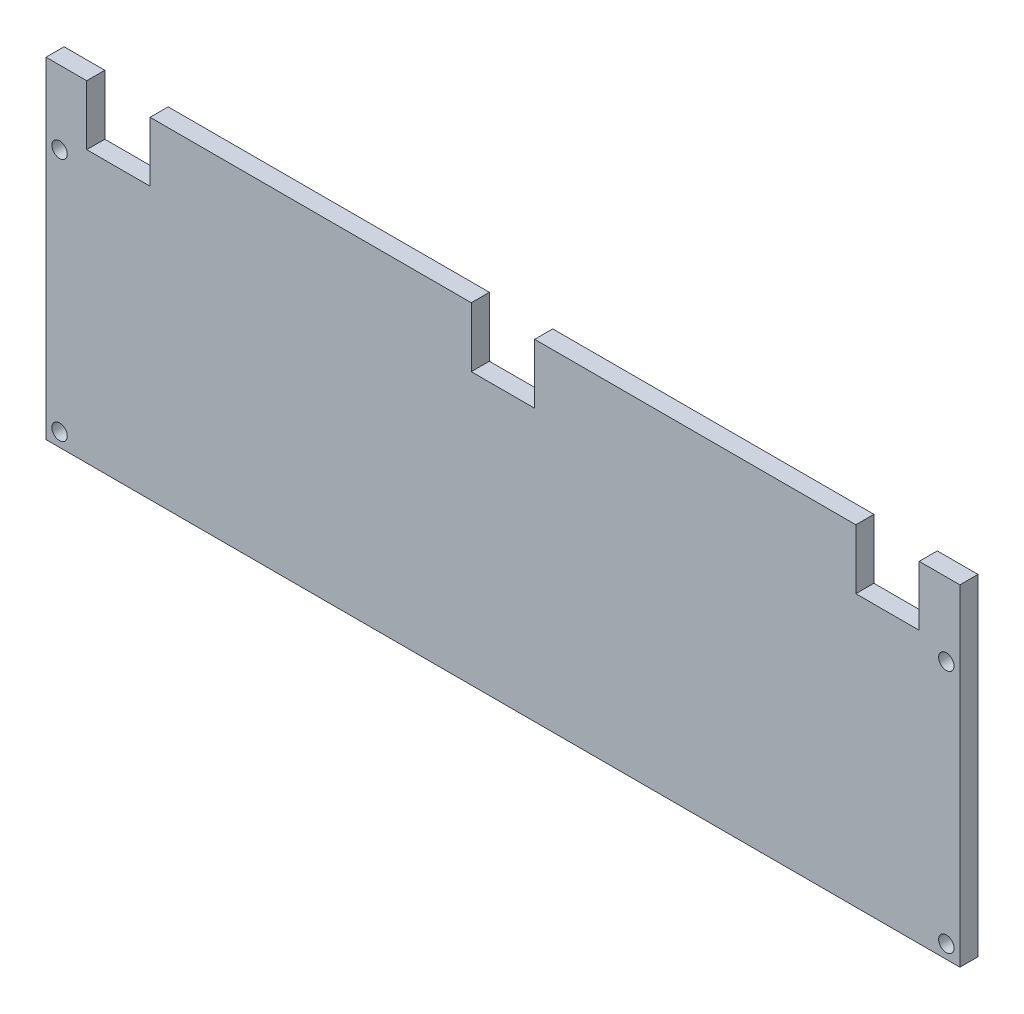
ISO-10303-21;
HEADER;
FILE_DESCRIPTION(('STEP AP214'),'2;1');
FILE_NAME('part.step','',(''),(''),'','','');
FILE_SCHEMA(('AUTOMOTIVE_DESIGN { 1 0 10303 214 1 1 1 1 }'));
ENDSEC;
DATA;
#1=APPLICATION_CONTEXT('core data for automotive mechanical design processes');
#2=APPLICATION_PROTOCOL_DEFINITION('international standard','automotive_design',2000,#1);
#3=PRODUCT_CONTEXT('',#1,'mechanical');
#4=PRODUCT('Part','Part','',(#3));
#5=PRODUCT_RELATED_PRODUCT_CATEGORY('part','',(#4));
#6=PRODUCT_DEFINITION_FORMATION('','',#4);
#7=PRODUCT_DEFINITION_CONTEXT('part definition',#1,'design');
#8=PRODUCT_DEFINITION('design','',#6,#7);
#9=PRODUCT_DEFINITION_SHAPE('','',#8);
#10=(LENGTH_UNIT() NAMED_UNIT(*) SI_UNIT(.MILLI.,.METRE.));
#11=(NAMED_UNIT(*) PLANE_ANGLE_UNIT() SI_UNIT($,.RADIAN.));
#12=(NAMED_UNIT(*) SI_UNIT($,.STERADIAN.) SOLID_ANGLE_UNIT());
#13=UNCERTAINTY_MEASURE_WITH_UNIT(LENGTH_MEASURE(1.E-05),#10,'distance_accuracy_value','');
#14=(GEOMETRIC_REPRESENTATION_CONTEXT(3) GLOBAL_UNCERTAINTY_ASSIGNED_CONTEXT((#13)) GLOBAL_UNIT_ASSIGNED_CONTEXT((#10,
#11,#12)) REPRESENTATION_CONTEXT('',''));
#15=CARTESIAN_POINT('',(0.,0.,0.));
#16=DIRECTION('',(0.,0.,1.));
#17=DIRECTION('',(1.,0.,0.));
#18=AXIS2_PLACEMENT_3D('',#15,#16,#17);
#19=CARTESIAN_POINT('',(-252.5,75.,-10.));
#20=DIRECTION('',(0.,1.,0.));
#21=DIRECTION('',(0.,0.,1.));
#22=AXIS2_PLACEMENT_3D('',#19,#20,#21);
#23=PLANE('',#22);
#24=DIRECTION('',(0.,0.,1.));
#25=VECTOR('',#24,1.);
#26=CARTESIAN_POINT('',(-17.5000000000003,74.9999999999988,-10.));
#27=LINE('',#26,#25);
#28=CARTESIAN_POINT('',(-17.5000000000003,74.9999999999988,-10.));
#29=VERTEX_POINT('',#28);
#30=CARTESIAN_POINT('',(-17.5000000000003,74.9999999999988,0.));
#31=VERTEX_POINT('',#30);
#32=EDGE_CURVE('E205',#29,#31,#27,.T.);
#33=ORIENTED_EDGE('',*,*,#32,.T.);
#34=DIRECTION('',(-1.,0.,0.));
#35=VECTOR('',#34,1.);
#36=CARTESIAN_POINT('',(-252.5,75.,0.));
#37=LINE('',#36,#35);
#38=CARTESIAN_POINT('',(17.4999999999997,75.,0.));
#39=VERTEX_POINT('',#38);
#40=EDGE_CURVE('E299',#39,#31,#37,.T.);
#41=ORIENTED_EDGE('',*,*,#40,.F.);
#42=DIRECTION('',(0.,0.,1.));
#43=VECTOR('',#42,1.);
#44=CARTESIAN_POINT('',(17.4999999999997,75.,-10.));
#45=LINE('',#44,#43);
#46=CARTESIAN_POINT('',(17.4999999999997,75.,-10.));
#47=VERTEX_POINT('',#46);
#48=EDGE_CURVE('E232',#47,#39,#45,.T.);
#49=ORIENTED_EDGE('',*,*,#48,.F.);
#50=DIRECTION('',(-1.,0.,0.));
#51=VECTOR('',#50,1.);
#52=CARTESIAN_POINT('',(-252.5,75.,-10.));
#53=LINE('',#52,#51);
#54=EDGE_CURVE('E288',#47,#29,#53,.T.);
#55=ORIENTED_EDGE('',*,*,#54,.T.);
#56=EDGE_LOOP('',(#33,#41,#49,#55));
#57=FACE_BOUND('',#56,.T.);
#58=ADVANCED_FACE('F41',(#57),#23,.T.);
#59=DIRECTION('',(0.,0.,1.));
#60=VECTOR('',#59,1.);
#61=CARTESIAN_POINT('',(195.,75.,-10.));
#62=LINE('',#61,#60);
#63=CARTESIAN_POINT('',(195.,75.,-10.));
#64=VERTEX_POINT('',#63);
#65=CARTESIAN_POINT('',(195.,75.,0.));
#66=VERTEX_POINT('',#65);
#67=EDGE_CURVE('E228',#64,#66,#62,.T.);
#68=ORIENTED_EDGE('',*,*,#67,.T.);
#69=CARTESIAN_POINT('',(230.,75.,0.));
#70=VERTEX_POINT('',#69);
#71=EDGE_CURVE('E295',#70,#66,#37,.T.);
#72=ORIENTED_EDGE('',*,*,#71,.F.);
#73=DIRECTION('',(0.,0.,1.));
#74=VECTOR('',#73,1.);
#75=CARTESIAN_POINT('',(230.,75.,-10.));
#76=LINE('',#75,#74);
#77=CARTESIAN_POINT('',(230.,75.,-10.));
#78=VERTEX_POINT('',#77);
#79=EDGE_CURVE('E249',#78,#70,#76,.T.);
#80=ORIENTED_EDGE('',*,*,#79,.F.);
#81=EDGE_CURVE('E285',#78,#64,#53,.T.);
#82=ORIENTED_EDGE('',*,*,#81,.T.);
#83=EDGE_LOOP('',(#68,#72,#80,#82));
#84=FACE_BOUND('',#83,.T.);
#85=ADVANCED_FACE('F320',(#84),#23,.T.);
#86=CARTESIAN_POINT('',(252.5,-75.,-10.));
#87=DIRECTION('',(1.,0.,0.));
#88=DIRECTION('',(0.,0.,-1.));
#89=AXIS2_PLACEMENT_3D('',#86,#87,#88);
#90=PLANE('',#89);
#91=DIRECTION('',(0.,1.,0.));
#92=VECTOR('',#91,1.);
#93=CARTESIAN_POINT('',(252.5,-75.,0.));
#94=LINE('',#93,#92);
#95=CARTESIAN_POINT('',(252.5,-75.,0.));
#96=VERTEX_POINT('',#95);
#97=CARTESIAN_POINT('',(252.5,108.,0.));
#98=VERTEX_POINT('',#97);
#99=EDGE_CURVE('E272',#96,#98,#94,.T.);
#100=ORIENTED_EDGE('',*,*,#99,.F.);
#101=DIRECTION('',(0.,0.,1.));
#102=VECTOR('',#101,1.);
#103=CARTESIAN_POINT('',(252.5,-75.,-10.));
#104=LINE('',#103,#102);
#105=CARTESIAN_POINT('',(252.5,-75.,-10.));
#106=VERTEX_POINT('',#105);
#107=EDGE_CURVE('E11',#106,#96,#104,.T.);
#108=ORIENTED_EDGE('',*,*,#107,.F.);
#109=DIRECTION('',(0.,1.,0.));
#110=VECTOR('',#109,1.);
#111=CARTESIAN_POINT('',(252.5,-75.,-10.));
#112=LINE('',#111,#110);
#113=CARTESIAN_POINT('',(252.5,108.,-10.));
#114=VERTEX_POINT('',#113);
#115=EDGE_CURVE('E281',#106,#114,#112,.T.);
#116=ORIENTED_EDGE('',*,*,#115,.T.);
#117=DIRECTION('',(0.,0.,1.));
#118=VECTOR('',#117,1.);
#119=CARTESIAN_POINT('',(252.5,108.,-10.));
#120=LINE('',#119,#118);
#121=EDGE_CURVE('E244',#114,#98,#120,.T.);
#122=ORIENTED_EDGE('',*,*,#121,.T.);
#123=EDGE_LOOP('',(#100,#108,#116,#122));
#124=FACE_BOUND('',#123,.T.);
#125=ADVANCED_FACE('F43',(#124),#90,.T.);
#126=CARTESIAN_POINT('',(-252.5,-75.,-10.));
#127=DIRECTION('',(0.,-1.,0.));
#128=DIRECTION('',(0.,0.,-1.));
#129=AXIS2_PLACEMENT_3D('',#126,#127,#128);
#130=PLANE('',#129);
#131=DIRECTION('',(1.,0.,0.));
#132=VECTOR('',#131,1.);
#133=CARTESIAN_POINT('',(-252.5,-75.,0.));
#134=LINE('',#133,#132);
#135=CARTESIAN_POINT('',(-252.5,-75.,0.));
#136=VERTEX_POINT('',#135);
#137=EDGE_CURVE('E284',#136,#96,#134,.T.);
#138=ORIENTED_EDGE('',*,*,#137,.F.);
#139=DIRECTION('',(0.,0.,1.));
#140=VECTOR('',#139,1.);
#141=CARTESIAN_POINT('',(-252.5,-75.,-10.));
#142=LINE('',#141,#140);
#143=CARTESIAN_POINT('',(-252.5,-75.,-10.));
#144=VERTEX_POINT('',#143);
#145=EDGE_CURVE('E45',#144,#136,#142,.T.);
#146=ORIENTED_EDGE('',*,*,#145,.F.);
#147=DIRECTION('',(1.,0.,0.));
#148=VECTOR('',#147,1.);
#149=CARTESIAN_POINT('',(-252.5,-75.,-10.));
#150=LINE('',#149,#148);
#151=EDGE_CURVE('E290',#144,#106,#150,.T.);
#152=ORIENTED_EDGE('',*,*,#151,.T.);
#153=ORIENTED_EDGE('',*,*,#107,.T.);
#154=EDGE_LOOP('',(#138,#146,#152,#153));
#155=FACE_BOUND('',#154,.T.);
#156=ADVANCED_FACE('F307',(#155),#130,.T.);
#157=CARTESIAN_POINT('',(-252.5,-75.,-10.));
#158=DIRECTION('',(-1.,0.,0.));
#159=DIRECTION('',(0.,0.,1.));
#160=AXIS2_PLACEMENT_3D('',#157,#158,#159);
#161=PLANE('',#160);
#162=DIRECTION('',(0.,-1.,0.));
#163=VECTOR('',#162,1.);
#164=CARTESIAN_POINT('',(-252.5,-75.,0.));
#165=LINE('',#164,#163);
#166=CARTESIAN_POINT('',(-252.5,108.,0.));
#167=VERTEX_POINT('',#166);
#168=EDGE_CURVE('E298',#167,#136,#165,.T.);
#169=ORIENTED_EDGE('',*,*,#168,.F.);
#170=DIRECTION('',(0.,0.,1.));
#171=VECTOR('',#170,1.);
#172=CARTESIAN_POINT('',(-252.5,108.,-10.));
#173=LINE('',#172,#171);
#174=CARTESIAN_POINT('',(-252.5,108.,-10.));
#175=VERTEX_POINT('',#174);
#176=EDGE_CURVE('E166',#175,#167,#173,.T.);
#177=ORIENTED_EDGE('',*,*,#176,.F.);
#178=DIRECTION('',(0.,-1.,0.));
#179=VECTOR('',#178,1.);
#180=CARTESIAN_POINT('',(-252.5,-75.,-10.));
#181=LINE('',#180,#179);
#182=EDGE_CURVE('E177',#175,#144,#181,.T.);
#183=ORIENTED_EDGE('',*,*,#182,.T.);
#184=ORIENTED_EDGE('',*,*,#145,.T.);
#185=EDGE_LOOP('',(#169,#177,#183,#184));
#186=FACE_BOUND('',#185,.T.);
#187=ADVANCED_FACE('F366',(#186),#161,.T.);
#188=DIRECTION('',(0.,0.,1.));
#189=VECTOR('',#188,1.);
#190=CARTESIAN_POINT('',(-230.,74.9999999999988,-10.));
#191=LINE('',#190,#189);
#192=CARTESIAN_POINT('',(-230.,74.9999999999988,-10.));
#193=VERTEX_POINT('',#192);
#194=CARTESIAN_POINT('',(-230.,74.9999999999988,0.));
#195=VERTEX_POINT('',#194);
#196=EDGE_CURVE('E182',#193,#195,#191,.T.);
#197=ORIENTED_EDGE('',*,*,#196,.T.);
#198=CARTESIAN_POINT('',(-195.,75.,0.));
#199=VERTEX_POINT('',#198);
#200=EDGE_CURVE('E294',#199,#195,#37,.T.);
#201=ORIENTED_EDGE('',*,*,#200,.F.);
#202=DIRECTION('',(0.,0.,1.));
#203=VECTOR('',#202,1.);
#204=CARTESIAN_POINT('',(-195.,74.9999999999988,-10.));
#205=LINE('',#204,#203);
#206=CARTESIAN_POINT('',(-195.,74.9999999999988,-10.));
#207=VERTEX_POINT('',#206);
#208=EDGE_CURVE('E209',#207,#199,#205,.T.);
#209=ORIENTED_EDGE('',*,*,#208,.F.);
#210=EDGE_CURVE('E283',#207,#193,#53,.T.);
#211=ORIENTED_EDGE('',*,*,#210,.T.);
#212=EDGE_LOOP('',(#197,#201,#209,#211));
#213=FACE_BOUND('',#212,.T.);
#214=ADVANCED_FACE('F339',(#213),#23,.T.);
#215=CARTESIAN_POINT('',(0.,0.,-10.));
#216=DIRECTION('',(0.,0.,-1.));
#217=DIRECTION('',(-1.,0.,0.));
#218=AXIS2_PLACEMENT_3D('',#215,#216,#217);
#219=PLANE('',#218);
#220=CARTESIAN_POINT('',(-244.999999999999,-67.5,-10.));
#221=DIRECTION('',(0.,0.,-1.));
#222=DIRECTION('',(1.,0.,0.));
#223=AXIS2_PLACEMENT_3D('',#220,#221,#222);
#224=CIRCLE('',#223,4.25000000000001);
#225=CARTESIAN_POINT('',(-240.749999999999,-67.5,-10.));
#226=VERTEX_POINT('',#225);
#227=EDGE_CURVE('E257',#226,#226,#224,.T.);
#228=ORIENTED_EDGE('',*,*,#227,.F.);
#229=EDGE_LOOP('',(#228));
#230=FACE_BOUND('',#229,.T.);
#231=CARTESIAN_POINT('',(244.999999999999,-67.5,-10.));
#232=DIRECTION('',(0.,0.,-1.));
#233=DIRECTION('',(-1.,0.,0.));
#234=AXIS2_PLACEMENT_3D('',#231,#232,#233);
#235=CIRCLE('',#234,4.25000000000001);
#236=CARTESIAN_POINT('',(240.749999999999,-67.5,-10.));
#237=VERTEX_POINT('',#236);
#238=EDGE_CURVE('E264',#237,#237,#235,.T.);
#239=ORIENTED_EDGE('',*,*,#238,.F.);
#240=EDGE_LOOP('',(#239));
#241=FACE_BOUND('',#240,.T.);
#242=CARTESIAN_POINT('',(-244.999999999999,67.5,-10.));
#243=DIRECTION('',(0.,0.,1.));
#244=DIRECTION('',(1.,0.,0.));
#245=AXIS2_PLACEMENT_3D('',#242,#243,#244);
#246=CIRCLE('',#245,4.25000000000001);
#247=CARTESIAN_POINT('',(-240.749999999999,67.5,-10.));
#248=VERTEX_POINT('',#247);
#249=EDGE_CURVE('E269',#248,#248,#246,.T.);
#250=ORIENTED_EDGE('',*,*,#249,.T.);
#251=EDGE_LOOP('',(#250));
#252=FACE_BOUND('',#251,.T.);
#253=CARTESIAN_POINT('',(244.999999999999,67.5,-10.));
#254=DIRECTION('',(0.,0.,1.));
#255=DIRECTION('',(-1.,0.,0.));
#256=AXIS2_PLACEMENT_3D('',#253,#254,#255);
#257=CIRCLE('',#256,4.25000000000001);
#258=CARTESIAN_POINT('',(240.749999999999,67.5,-10.));
#259=VERTEX_POINT('',#258);
#260=EDGE_CURVE('E276',#259,#259,#257,.T.);
#261=ORIENTED_EDGE('',*,*,#260,.T.);
#262=EDGE_LOOP('',(#261));
#263=FACE_BOUND('',#262,.T.);
#264=ORIENTED_EDGE('',*,*,#115,.F.);
#265=ORIENTED_EDGE('',*,*,#151,.F.);
#266=ORIENTED_EDGE('',*,*,#182,.F.);
#267=DIRECTION('',(-1.,0.,0.));
#268=VECTOR('',#267,1.);
#269=CARTESIAN_POINT('',(-230.,108.,-10.));
#270=LINE('',#269,#268);
#271=CARTESIAN_POINT('',(-230.,108.,-10.));
#272=VERTEX_POINT('',#271);
#273=EDGE_CURVE('E160',#272,#175,#270,.T.);
#274=ORIENTED_EDGE('',*,*,#273,.F.);
#275=DIRECTION('',(0.,1.,0.));
#276=VECTOR('',#275,1.);
#277=CARTESIAN_POINT('',(-230.,74.9999999999988,-10.));
#278=LINE('',#277,#276);
#279=EDGE_CURVE('E173',#193,#272,#278,.T.);
#280=ORIENTED_EDGE('',*,*,#279,.F.);
#281=ORIENTED_EDGE('',*,*,#210,.F.);
#282=DIRECTION('',(0.,-1.,0.));
#283=VECTOR('',#282,1.);
#284=CARTESIAN_POINT('',(-195.,74.9999999999988,-10.));
#285=LINE('',#284,#283);
#286=CARTESIAN_POINT('',(-195.,108.,-10.));
#287=VERTEX_POINT('',#286);
#288=EDGE_CURVE('E197',#287,#207,#285,.T.);
#289=ORIENTED_EDGE('',*,*,#288,.F.);
#290=DIRECTION('',(-1.,0.,0.));
#291=VECTOR('',#290,1.);
#292=CARTESIAN_POINT('',(-17.5000000000003,108.,-10.));
#293=LINE('',#292,#291);
#294=CARTESIAN_POINT('',(-17.5000000000003,108.,-10.));
#295=VERTEX_POINT('',#294);
#296=EDGE_CURVE('E194',#295,#287,#293,.T.);
#297=ORIENTED_EDGE('',*,*,#296,.F.);
#298=DIRECTION('',(0.,1.,0.));
#299=VECTOR('',#298,1.);
#300=CARTESIAN_POINT('',(-17.5000000000003,74.9999999999988,-10.));
#301=LINE('',#300,#299);
#302=EDGE_CURVE('E191',#29,#295,#301,.T.);
#303=ORIENTED_EDGE('',*,*,#302,.F.);
#304=ORIENTED_EDGE('',*,*,#54,.F.);
#305=DIRECTION('',(0.,-1.,0.));
#306=VECTOR('',#305,1.);
#307=CARTESIAN_POINT('',(17.4999999999997,75.,-10.));
#308=LINE('',#307,#306);
#309=CARTESIAN_POINT('',(17.4999999999997,108.,-10.));
#310=VERTEX_POINT('',#309);
#311=EDGE_CURVE('E220',#310,#47,#308,.T.);
#312=ORIENTED_EDGE('',*,*,#311,.F.);
#313=DIRECTION('',(-1.,0.,0.));
#314=VECTOR('',#313,1.);
#315=CARTESIAN_POINT('',(195.,108.,-10.));
#316=LINE('',#315,#314);
#317=CARTESIAN_POINT('',(195.,108.,-10.));
#318=VERTEX_POINT('',#317);
#319=EDGE_CURVE('E217',#318,#310,#316,.T.);
#320=ORIENTED_EDGE('',*,*,#319,.F.);
#321=DIRECTION('',(0.,1.,0.));
#322=VECTOR('',#321,1.);
#323=CARTESIAN_POINT('',(195.,75.,-10.));
#324=LINE('',#323,#322);
#325=EDGE_CURVE('E214',#64,#318,#324,.T.);
#326=ORIENTED_EDGE('',*,*,#325,.F.);
#327=ORIENTED_EDGE('',*,*,#81,.F.);
#328=DIRECTION('',(0.,-1.,0.));
#329=VECTOR('',#328,1.);
#330=CARTESIAN_POINT('',(230.,75.,-10.));
#331=LINE('',#330,#329);
#332=CARTESIAN_POINT('',(230.,108.,-10.));
#333=VERTEX_POINT('',#332);
#334=EDGE_CURVE('E240',#333,#78,#331,.T.);
#335=ORIENTED_EDGE('',*,*,#334,.F.);
#336=DIRECTION('',(-1.,0.,0.));
#337=VECTOR('',#336,1.);
#338=CARTESIAN_POINT('',(252.5,108.,-10.));
#339=LINE('',#338,#337);
#340=EDGE_CURVE('E237',#114,#333,#339,.T.);
#341=ORIENTED_EDGE('',*,*,#340,.F.);
#342=EDGE_LOOP('',(#264,#265,#266,#274,#280,#281,#289,#297,#303,#304,#312,#320,#326,#327,#335,#341));
#343=FACE_BOUND('',#342,.T.);
#344=ADVANCED_FACE('F171',(#230,#241,#252,#263,#343),#219,.T.);
#345=CARTESIAN_POINT('',(0.,0.,0.));
#346=DIRECTION('',(0.,0.,-1.));
#347=DIRECTION('',(-1.,0.,0.));
#348=AXIS2_PLACEMENT_3D('',#345,#346,#347);
#349=PLANE('',#348);
#350=CARTESIAN_POINT('',(-244.999999999999,-67.5,0.));
#351=DIRECTION('',(0.,0.,-1.));
#352=DIRECTION('',(1.,0.,0.));
#353=AXIS2_PLACEMENT_3D('',#350,#351,#352);
#354=CIRCLE('',#353,4.25000000000001);
#355=CARTESIAN_POINT('',(-240.749999999999,-67.5,0.));
#356=VERTEX_POINT('',#355);
#357=EDGE_CURVE('E261',#356,#356,#354,.T.);
#358=ORIENTED_EDGE('',*,*,#357,.T.);
#359=EDGE_LOOP('',(#358));
#360=FACE_BOUND('',#359,.T.);
#361=CARTESIAN_POINT('',(244.999999999999,-67.5,0.));
#362=DIRECTION('',(0.,0.,-1.));
#363=DIRECTION('',(-1.,0.,0.));
#364=AXIS2_PLACEMENT_3D('',#361,#362,#363);
#365=CIRCLE('',#364,4.25000000000001);
#366=CARTESIAN_POINT('',(240.749999999999,-67.5,0.));
#367=VERTEX_POINT('',#366);
#368=EDGE_CURVE('E252',#367,#367,#365,.T.);
#369=ORIENTED_EDGE('',*,*,#368,.T.);
#370=EDGE_LOOP('',(#369));
#371=FACE_BOUND('',#370,.T.);
#372=CARTESIAN_POINT('',(-244.999999999999,67.5,0.));
#373=DIRECTION('',(0.,0.,1.));
#374=DIRECTION('',(1.,0.,0.));
#375=AXIS2_PLACEMENT_3D('',#372,#373,#374);
#376=CIRCLE('',#375,4.25000000000001);
#377=CARTESIAN_POINT('',(-240.749999999999,67.5,0.));
#378=VERTEX_POINT('',#377);
#379=EDGE_CURVE('E273',#378,#378,#376,.T.);
#380=ORIENTED_EDGE('',*,*,#379,.F.);
#381=EDGE_LOOP('',(#380));
#382=FACE_BOUND('',#381,.T.);
#383=CARTESIAN_POINT('',(244.999999999999,67.5,0.));
#384=DIRECTION('',(0.,0.,1.));
#385=DIRECTION('',(-1.,0.,0.));
#386=AXIS2_PLACEMENT_3D('',#383,#384,#385);
#387=CIRCLE('',#386,4.25000000000001);
#388=CARTESIAN_POINT('',(240.749999999999,67.5,0.));
#389=VERTEX_POINT('',#388);
#390=EDGE_CURVE('E260',#389,#389,#387,.T.);
#391=ORIENTED_EDGE('',*,*,#390,.F.);
#392=EDGE_LOOP('',(#391));
#393=FACE_BOUND('',#392,.T.);
#394=ORIENTED_EDGE('',*,*,#99,.T.);
#395=DIRECTION('',(-1.,0.,0.));
#396=VECTOR('',#395,1.);
#397=CARTESIAN_POINT('',(252.5,108.,0.));
#398=LINE('',#397,#396);
#399=CARTESIAN_POINT('',(230.,108.,0.));
#400=VERTEX_POINT('',#399);
#401=EDGE_CURVE('E231',#98,#400,#398,.T.);
#402=ORIENTED_EDGE('',*,*,#401,.T.);
#403=DIRECTION('',(0.,-1.,0.));
#404=VECTOR('',#403,1.);
#405=CARTESIAN_POINT('',(230.,75.,0.));
#406=LINE('',#405,#404);
#407=EDGE_CURVE('E241',#400,#70,#406,.T.);
#408=ORIENTED_EDGE('',*,*,#407,.T.);
#409=ORIENTED_EDGE('',*,*,#71,.T.);
#410=DIRECTION('',(0.,1.,0.));
#411=VECTOR('',#410,1.);
#412=CARTESIAN_POINT('',(195.,75.,0.));
#413=LINE('',#412,#411);
#414=CARTESIAN_POINT('',(195.,108.,0.));
#415=VERTEX_POINT('',#414);
#416=EDGE_CURVE('E208',#66,#415,#413,.T.);
#417=ORIENTED_EDGE('',*,*,#416,.T.);
#418=DIRECTION('',(-1.,0.,0.));
#419=VECTOR('',#418,1.);
#420=CARTESIAN_POINT('',(195.,108.,0.));
#421=LINE('',#420,#419);
#422=CARTESIAN_POINT('',(17.4999999999997,108.,0.));
#423=VERTEX_POINT('',#422);
#424=EDGE_CURVE('E225',#415,#423,#421,.T.);
#425=ORIENTED_EDGE('',*,*,#424,.T.);
#426=DIRECTION('',(0.,-1.,0.));
#427=VECTOR('',#426,1.);
#428=CARTESIAN_POINT('',(17.4999999999997,75.,0.));
#429=LINE('',#428,#427);
#430=EDGE_CURVE('E63',#423,#39,#429,.T.);
#431=ORIENTED_EDGE('',*,*,#430,.T.);
#432=ORIENTED_EDGE('',*,*,#40,.T.);
#433=DIRECTION('',(0.,1.,0.));
#434=VECTOR('',#433,1.);
#435=CARTESIAN_POINT('',(-17.5000000000003,74.9999999999988,0.));
#436=LINE('',#435,#434);
#437=CARTESIAN_POINT('',(-17.5000000000003,108.,0.));
#438=VERTEX_POINT('',#437);
#439=EDGE_CURVE('E189',#31,#438,#436,.T.);
#440=ORIENTED_EDGE('',*,*,#439,.T.);
#441=DIRECTION('',(-1.,0.,0.));
#442=VECTOR('',#441,1.);
#443=CARTESIAN_POINT('',(-17.5000000000003,108.,0.));
#444=LINE('',#443,#442);
#445=CARTESIAN_POINT('',(-195.,108.,0.));
#446=VERTEX_POINT('',#445);
#447=EDGE_CURVE('E202',#438,#446,#444,.T.);
#448=ORIENTED_EDGE('',*,*,#447,.T.);
#449=DIRECTION('',(0.,-1.,0.));
#450=VECTOR('',#449,1.);
#451=CARTESIAN_POINT('',(-195.,74.9999999999988,0.));
#452=LINE('',#451,#450);
#453=EDGE_CURVE('E56',#446,#199,#452,.T.);
#454=ORIENTED_EDGE('',*,*,#453,.T.);
#455=ORIENTED_EDGE('',*,*,#200,.T.);
#456=DIRECTION('',(0.,1.,0.));
#457=VECTOR('',#456,1.);
#458=CARTESIAN_POINT('',(-230.,74.9999999999988,0.));
#459=LINE('',#458,#457);
#460=CARTESIAN_POINT('',(-230.,108.,0.));
#461=VERTEX_POINT('',#460);
#462=EDGE_CURVE('E184',#195,#461,#459,.T.);
#463=ORIENTED_EDGE('',*,*,#462,.T.);
#464=DIRECTION('',(-1.,0.,0.));
#465=VECTOR('',#464,1.);
#466=CARTESIAN_POINT('',(-230.,108.,0.));
#467=LINE('',#466,#465);
#468=EDGE_CURVE('E162',#461,#167,#467,.T.);
#469=ORIENTED_EDGE('',*,*,#468,.T.);
#470=ORIENTED_EDGE('',*,*,#168,.T.);
#471=ORIENTED_EDGE('',*,*,#137,.T.);
#472=EDGE_LOOP('',(#394,#402,#408,#409,#417,#425,#431,#432,#440,#448,#454,#455,#463,#469,#470,#471));
#473=FACE_BOUND('',#472,.T.);
#474=ADVANCED_FACE('F304',(#360,#371,#382,#393,#473),#349,.F.);
#475=CARTESIAN_POINT('',(244.999999999999,67.5,-10.));
#476=DIRECTION('',(0.,0.,1.));
#477=DIRECTION('',(1.,0.,0.));
#478=AXIS2_PLACEMENT_3D('',#475,#476,#477);
#479=CYLINDRICAL_SURFACE('',#478,4.25000000000001);
#480=ORIENTED_EDGE('',*,*,#260,.F.);
#481=EDGE_LOOP('',(#480));
#482=FACE_BOUND('',#481,.T.);
#483=ORIENTED_EDGE('',*,*,#390,.T.);
#484=EDGE_LOOP('',(#483));
#485=FACE_BOUND('',#484,.T.);
#486=ADVANCED_FACE('F382',(#482,#485),#479,.F.);
#487=CARTESIAN_POINT('',(-244.999999999999,67.5,-10.));
#488=DIRECTION('',(0.,0.,1.));
#489=DIRECTION('',(1.,0.,0.));
#490=AXIS2_PLACEMENT_3D('',#487,#488,#489);
#491=CYLINDRICAL_SURFACE('',#490,4.25000000000001);
#492=ORIENTED_EDGE('',*,*,#249,.F.);
#493=EDGE_LOOP('',(#492));
#494=FACE_BOUND('',#493,.T.);
#495=ORIENTED_EDGE('',*,*,#379,.T.);
#496=EDGE_LOOP('',(#495));
#497=FACE_BOUND('',#496,.T.);
#498=ADVANCED_FACE('F387',(#494,#497),#491,.F.);
#499=CARTESIAN_POINT('',(244.999999999999,-67.5,-10.));
#500=DIRECTION('',(0.,0.,1.));
#501=DIRECTION('',(1.,0.,0.));
#502=AXIS2_PLACEMENT_3D('',#499,#500,#501);
#503=CYLINDRICAL_SURFACE('',#502,4.25000000000001);
#504=ORIENTED_EDGE('',*,*,#238,.T.);
#505=EDGE_LOOP('',(#504));
#506=FACE_BOUND('',#505,.T.);
#507=ORIENTED_EDGE('',*,*,#368,.F.);
#508=EDGE_LOOP('',(#507));
#509=FACE_BOUND('',#508,.T.);
#510=ADVANCED_FACE('F391',(#506,#509),#503,.F.);
#511=CARTESIAN_POINT('',(-244.999999999999,-67.5,-10.));
#512=DIRECTION('',(0.,0.,1.));
#513=DIRECTION('',(1.,0.,0.));
#514=AXIS2_PLACEMENT_3D('',#511,#512,#513);
#515=CYLINDRICAL_SURFACE('',#514,4.25000000000001);
#516=ORIENTED_EDGE('',*,*,#227,.T.);
#517=EDGE_LOOP('',(#516));
#518=FACE_BOUND('',#517,.T.);
#519=ORIENTED_EDGE('',*,*,#357,.F.);
#520=EDGE_LOOP('',(#519));
#521=FACE_BOUND('',#520,.T.);
#522=ADVANCED_FACE('F395',(#518,#521),#515,.F.);
#523=CARTESIAN_POINT('',(230.,75.,-10.));
#524=DIRECTION('',(-1.,0.,0.));
#525=DIRECTION('',(0.,0.,1.));
#526=AXIS2_PLACEMENT_3D('',#523,#524,#525);
#527=PLANE('',#526);
#528=ORIENTED_EDGE('',*,*,#407,.F.);
#529=DIRECTION('',(0.,0.,1.));
#530=VECTOR('',#529,1.);
#531=CARTESIAN_POINT('',(230.,108.,-10.));
#532=LINE('',#531,#530);
#533=EDGE_CURVE('E253',#333,#400,#532,.T.);
#534=ORIENTED_EDGE('',*,*,#533,.F.);
#535=ORIENTED_EDGE('',*,*,#334,.T.);
#536=ORIENTED_EDGE('',*,*,#79,.T.);
#537=EDGE_LOOP('',(#528,#534,#535,#536));
#538=FACE_BOUND('',#537,.T.);
#539=ADVANCED_FACE('F316',(#538),#527,.T.);
#540=CARTESIAN_POINT('',(252.5,108.,-10.));
#541=DIRECTION('',(0.,1.,0.));
#542=DIRECTION('',(0.,0.,1.));
#543=AXIS2_PLACEMENT_3D('',#540,#541,#542);
#544=PLANE('',#543);
#545=ORIENTED_EDGE('',*,*,#401,.F.);
#546=ORIENTED_EDGE('',*,*,#121,.F.);
#547=ORIENTED_EDGE('',*,*,#340,.T.);
#548=ORIENTED_EDGE('',*,*,#533,.T.);
#549=EDGE_LOOP('',(#545,#546,#547,#548));
#550=FACE_BOUND('',#549,.T.);
#551=ADVANCED_FACE('F313',(#550),#544,.T.);
#552=CARTESIAN_POINT('',(195.,75.,-10.));
#553=DIRECTION('',(1.,0.,0.));
#554=DIRECTION('',(0.,0.,-1.));
#555=AXIS2_PLACEMENT_3D('',#552,#553,#554);
#556=PLANE('',#555);
#557=ORIENTED_EDGE('',*,*,#416,.F.);
#558=ORIENTED_EDGE('',*,*,#67,.F.);
#559=ORIENTED_EDGE('',*,*,#325,.T.);
#560=DIRECTION('',(0.,0.,1.));
#561=VECTOR('',#560,1.);
#562=CARTESIAN_POINT('',(195.,108.,-10.));
#563=LINE('',#562,#561);
#564=EDGE_CURVE('E222',#318,#415,#563,.T.);
#565=ORIENTED_EDGE('',*,*,#564,.T.);
#566=EDGE_LOOP('',(#557,#558,#559,#565));
#567=FACE_BOUND('',#566,.T.);
#568=ADVANCED_FACE('F325',(#567),#556,.T.);
#569=CARTESIAN_POINT('',(17.4999999999997,75.,-10.));
#570=DIRECTION('',(-1.,0.,0.));
#571=DIRECTION('',(0.,0.,1.));
#572=AXIS2_PLACEMENT_3D('',#569,#570,#571);
#573=PLANE('',#572);
#574=ORIENTED_EDGE('',*,*,#430,.F.);
#575=DIRECTION('',(0.,0.,1.));
#576=VECTOR('',#575,1.);
#577=CARTESIAN_POINT('',(17.4999999999997,108.,-10.));
#578=LINE('',#577,#576);
#579=EDGE_CURVE('E234',#310,#423,#578,.T.);
#580=ORIENTED_EDGE('',*,*,#579,.F.);
#581=ORIENTED_EDGE('',*,*,#311,.T.);
#582=ORIENTED_EDGE('',*,*,#48,.T.);
#583=EDGE_LOOP('',(#574,#580,#581,#582));
#584=FACE_BOUND('',#583,.T.);
#585=ADVANCED_FACE('F330',(#584),#573,.T.);
#586=CARTESIAN_POINT('',(195.,108.,-10.));
#587=DIRECTION('',(0.,1.,0.));
#588=DIRECTION('',(-1.,0.,0.));
#589=AXIS2_PLACEMENT_3D('',#586,#587,#588);
#590=PLANE('',#589);
#591=ORIENTED_EDGE('',*,*,#424,.F.);
#592=ORIENTED_EDGE('',*,*,#564,.F.);
#593=ORIENTED_EDGE('',*,*,#319,.T.);
#594=ORIENTED_EDGE('',*,*,#579,.T.);
#595=EDGE_LOOP('',(#591,#592,#593,#594));
#596=FACE_BOUND('',#595,.T.);
#597=ADVANCED_FACE('F328',(#596),#590,.T.);
#598=CARTESIAN_POINT('',(-17.5000000000003,74.9999999999988,-10.));
#599=DIRECTION('',(1.,0.,0.));
#600=DIRECTION('',(0.,0.,-1.));
#601=AXIS2_PLACEMENT_3D('',#598,#599,#600);
#602=PLANE('',#601);
#603=ORIENTED_EDGE('',*,*,#439,.F.);
#604=ORIENTED_EDGE('',*,*,#32,.F.);
#605=ORIENTED_EDGE('',*,*,#302,.T.);
#606=DIRECTION('',(0.,0.,1.));
#607=VECTOR('',#606,1.);
#608=CARTESIAN_POINT('',(-17.5000000000003,108.,-10.));
#609=LINE('',#608,#607);
#610=EDGE_CURVE('E199',#295,#438,#609,.T.);
#611=ORIENTED_EDGE('',*,*,#610,.T.);
#612=EDGE_LOOP('',(#603,#604,#605,#611));
#613=FACE_BOUND('',#612,.T.);
#614=ADVANCED_FACE('F344',(#613),#602,.T.);
#615=CARTESIAN_POINT('',(-195.,74.9999999999988,-10.));
#616=DIRECTION('',(-1.,0.,0.));
#617=DIRECTION('',(0.,0.,1.));
#618=AXIS2_PLACEMENT_3D('',#615,#616,#617);
#619=PLANE('',#618);
#620=ORIENTED_EDGE('',*,*,#453,.F.);
#621=DIRECTION('',(0.,0.,1.));
#622=VECTOR('',#621,1.);
#623=CARTESIAN_POINT('',(-195.,108.,-10.));
#624=LINE('',#623,#622);
#625=EDGE_CURVE('E211',#287,#446,#624,.T.);
#626=ORIENTED_EDGE('',*,*,#625,.F.);
#627=ORIENTED_EDGE('',*,*,#288,.T.);
#628=ORIENTED_EDGE('',*,*,#208,.T.);
#629=EDGE_LOOP('',(#620,#626,#627,#628));
#630=FACE_BOUND('',#629,.T.);
#631=ADVANCED_FACE('F349',(#630),#619,.T.);
#632=CARTESIAN_POINT('',(-17.5000000000003,108.,-10.));
#633=DIRECTION('',(0.,1.,0.));
#634=DIRECTION('',(0.,0.,1.));
#635=AXIS2_PLACEMENT_3D('',#632,#633,#634);
#636=PLANE('',#635);
#637=ORIENTED_EDGE('',*,*,#447,.F.);
#638=ORIENTED_EDGE('',*,*,#610,.F.);
#639=ORIENTED_EDGE('',*,*,#296,.T.);
#640=ORIENTED_EDGE('',*,*,#625,.T.);
#641=EDGE_LOOP('',(#637,#638,#639,#640));
#642=FACE_BOUND('',#641,.T.);
#643=ADVANCED_FACE('F347',(#642),#636,.T.);
#644=CARTESIAN_POINT('',(-230.,74.9999999999988,-10.));
#645=DIRECTION('',(1.,0.,0.));
#646=DIRECTION('',(0.,0.,-1.));
#647=AXIS2_PLACEMENT_3D('',#644,#645,#646);
#648=PLANE('',#647);
#649=ORIENTED_EDGE('',*,*,#462,.F.);
#650=ORIENTED_EDGE('',*,*,#196,.F.);
#651=ORIENTED_EDGE('',*,*,#279,.T.);
#652=DIRECTION('',(0.,0.,1.));
#653=VECTOR('',#652,1.);
#654=CARTESIAN_POINT('',(-230.,108.,-10.));
#655=LINE('',#654,#653);
#656=EDGE_CURVE('E156',#272,#461,#655,.T.);
#657=ORIENTED_EDGE('',*,*,#656,.T.);
#658=EDGE_LOOP('',(#649,#650,#651,#657));
#659=FACE_BOUND('',#658,.T.);
#660=ADVANCED_FACE('F180',(#659),#648,.T.);
#661=CARTESIAN_POINT('',(-230.,108.,-10.));
#662=DIRECTION('',(0.,1.,0.));
#663=DIRECTION('',(0.,0.,1.));
#664=AXIS2_PLACEMENT_3D('',#661,#662,#663);
#665=PLANE('',#664);
#666=ORIENTED_EDGE('',*,*,#468,.F.);
#667=ORIENTED_EDGE('',*,*,#656,.F.);
#668=ORIENTED_EDGE('',*,*,#273,.T.);
#669=ORIENTED_EDGE('',*,*,#176,.T.);
#670=EDGE_LOOP('',(#666,#667,#668,#669));
#671=FACE_BOUND('',#670,.T.);
#672=ADVANCED_FACE('F158',(#671),#665,.T.);
#673=CLOSED_SHELL('',(#58,#85,#125,#156,#187,#214,#344,#474,#486,#498,#510,#522,#539,#551,#568,
#585,#597,#614,#631,#643,#660,#672));
#674=MANIFOLD_SOLID_BREP('B2',#673);
#675=ADVANCED_BREP_SHAPE_REPRESENTATION('',(#18,#674),#14);
#676=SHAPE_DEFINITION_REPRESENTATION(#9,#675);
ENDSEC;
END-ISO-10303-21;
